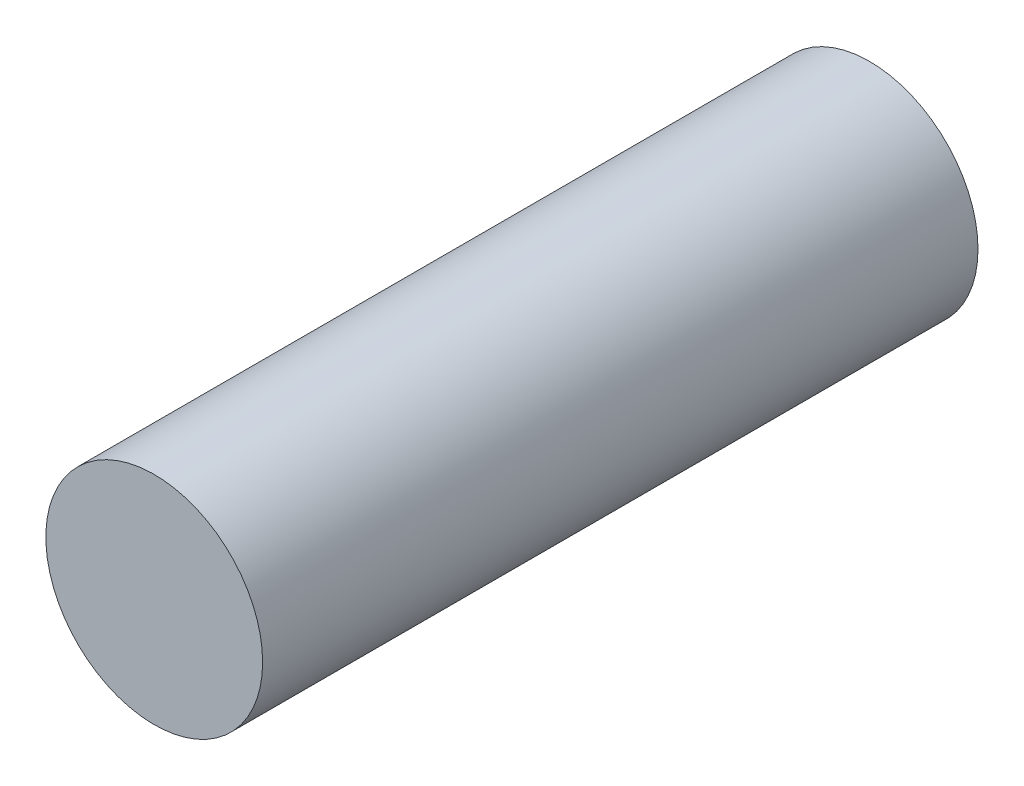
ISO-10303-21;
HEADER;
FILE_DESCRIPTION(('STEP AP214'),'2;1');
FILE_NAME('part.step','',(''),(''),'','','');
FILE_SCHEMA(('AUTOMOTIVE_DESIGN { 1 0 10303 214 1 1 1 1 }'));
ENDSEC;
DATA;
#1=APPLICATION_CONTEXT('core data for automotive mechanical design processes');
#2=APPLICATION_PROTOCOL_DEFINITION('international standard','automotive_design',2000,#1);
#3=PRODUCT_CONTEXT('',#1,'mechanical');
#4=PRODUCT('Part','Part','',(#3));
#5=PRODUCT_RELATED_PRODUCT_CATEGORY('part','',(#4));
#6=PRODUCT_DEFINITION_FORMATION('','',#4);
#7=PRODUCT_DEFINITION_CONTEXT('part definition',#1,'design');
#8=PRODUCT_DEFINITION('design','',#6,#7);
#9=PRODUCT_DEFINITION_SHAPE('','',#8);
#10=(LENGTH_UNIT() NAMED_UNIT(*) SI_UNIT(.MILLI.,.METRE.));
#11=(NAMED_UNIT(*) PLANE_ANGLE_UNIT() SI_UNIT($,.RADIAN.));
#12=(NAMED_UNIT(*) SI_UNIT($,.STERADIAN.) SOLID_ANGLE_UNIT());
#13=UNCERTAINTY_MEASURE_WITH_UNIT(LENGTH_MEASURE(1.E-05),#10,'distance_accuracy_value','');
#14=(GEOMETRIC_REPRESENTATION_CONTEXT(3) GLOBAL_UNCERTAINTY_ASSIGNED_CONTEXT((#13)) GLOBAL_UNIT_ASSIGNED_CONTEXT((#10,
#11,#12)) REPRESENTATION_CONTEXT('',''));
#15=CARTESIAN_POINT('',(0.,0.,0.));
#16=DIRECTION('',(0.,0.,1.));
#17=DIRECTION('',(1.,0.,0.));
#18=AXIS2_PLACEMENT_3D('',#15,#16,#17);
#19=CARTESIAN_POINT('',(0.,0.,26.68984375));
#20=DIRECTION('',(0.,0.,-1.));
#21=DIRECTION('',(-1.,0.,0.));
#22=AXIS2_PLACEMENT_3D('',#19,#20,#21);
#23=PLANE('',#22);
#24=CARTESIAN_POINT('',(0.,0.,26.68984375));
#25=DIRECTION('',(0.,0.,1.));
#26=DIRECTION('',(1.,0.,0.));
#27=AXIS2_PLACEMENT_3D('',#24,#25,#26);
#28=CIRCLE('',#27,0.9921875);
#29=CARTESIAN_POINT('',(0.9921875,0.,26.68984375));
#30=VERTEX_POINT('',#29);
#31=EDGE_CURVE('E17',#30,#30,#28,.F.);
#32=ORIENTED_EDGE('',*,*,#31,.F.);
#33=EDGE_LOOP('',(#32));
#34=FACE_BOUND('',#33,.T.);
#35=ADVANCED_FACE('F14',(#34),#23,.F.);
#36=CARTESIAN_POINT('',(0.,0.,20.14140625));
#37=DIRECTION('',(0.,0.,1.));
#38=DIRECTION('',(1.,0.,0.));
#39=AXIS2_PLACEMENT_3D('',#36,#37,#38);
#40=PLANE('',#39);
#41=CARTESIAN_POINT('',(0.,0.,20.14140625));
#42=DIRECTION('',(0.,0.,1.));
#43=DIRECTION('',(1.,0.,0.));
#44=AXIS2_PLACEMENT_3D('',#41,#42,#43);
#45=CIRCLE('',#44,0.9921875);
#46=CARTESIAN_POINT('',(0.9921875,0.,20.14140625));
#47=VERTEX_POINT('',#46);
#48=EDGE_CURVE('E10',#47,#47,#45,.T.);
#49=ORIENTED_EDGE('',*,*,#48,.F.);
#50=EDGE_LOOP('',(#49));
#51=FACE_BOUND('',#50,.T.);
#52=ADVANCED_FACE('F29',(#51),#40,.F.);
#53=CARTESIAN_POINT('',(0.,0.,26.68984375));
#54=DIRECTION('',(0.,0.,1.));
#55=DIRECTION('',(1.,0.,0.));
#56=AXIS2_PLACEMENT_3D('',#53,#54,#55);
#57=CYLINDRICAL_SURFACE('',#56,0.9921875);
#58=ORIENTED_EDGE('',*,*,#31,.T.);
#59=EDGE_LOOP('',(#58));
#60=FACE_BOUND('',#59,.T.);
#61=ORIENTED_EDGE('',*,*,#48,.T.);
#62=EDGE_LOOP('',(#61));
#63=FACE_BOUND('',#62,.T.);
#64=ADVANCED_FACE('F26',(#60,#63),#57,.T.);
#65=CLOSED_SHELL('',(#35,#52,#64));
#66=MANIFOLD_SOLID_BREP('B1',#65);
#67=ADVANCED_BREP_SHAPE_REPRESENTATION('',(#18,#66),#14);
#68=SHAPE_DEFINITION_REPRESENTATION(#9,#67);
ENDSEC;
END-ISO-10303-21;
